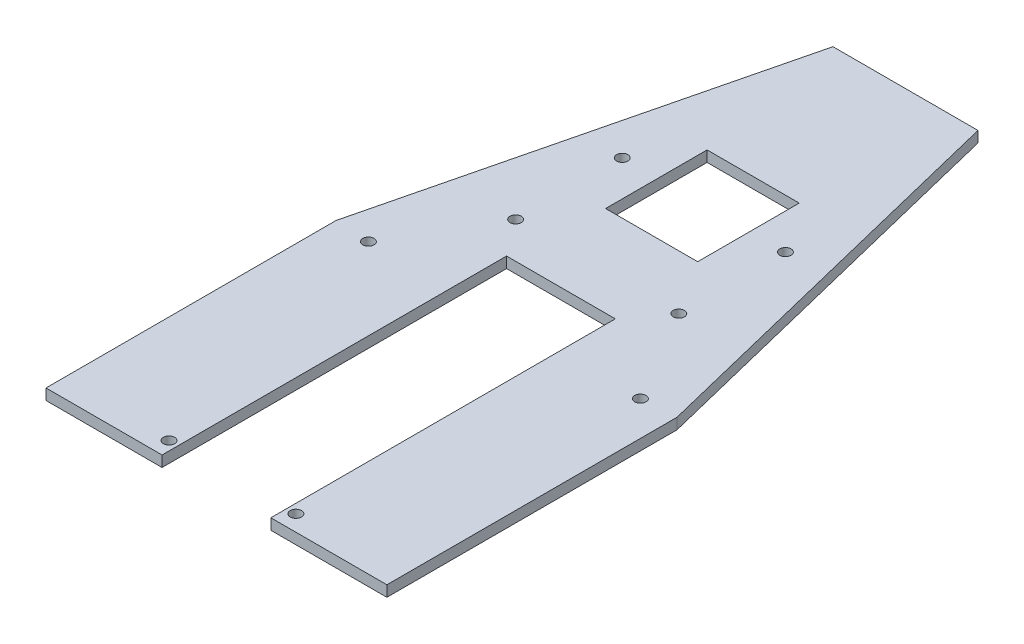
ISO-10303-21;
HEADER;
FILE_DESCRIPTION(('STEP AP214'),'2;1');
FILE_NAME('part.step','',(''),(''),'','','');
FILE_SCHEMA(('AUTOMOTIVE_DESIGN { 1 0 10303 214 1 1 1 1 }'));
ENDSEC;
DATA;
#1=APPLICATION_CONTEXT('core data for automotive mechanical design processes');
#2=APPLICATION_PROTOCOL_DEFINITION('international standard','automotive_design',2000,#1);
#3=PRODUCT_CONTEXT('',#1,'mechanical');
#4=PRODUCT('Part','Part','',(#3));
#5=PRODUCT_RELATED_PRODUCT_CATEGORY('part','',(#4));
#6=PRODUCT_DEFINITION_FORMATION('','',#4);
#7=PRODUCT_DEFINITION_CONTEXT('part definition',#1,'design');
#8=PRODUCT_DEFINITION('design','',#6,#7);
#9=PRODUCT_DEFINITION_SHAPE('','',#8);
#10=(LENGTH_UNIT() NAMED_UNIT(*) SI_UNIT(.MILLI.,.METRE.));
#11=(NAMED_UNIT(*) PLANE_ANGLE_UNIT() SI_UNIT($,.RADIAN.));
#12=(NAMED_UNIT(*) SI_UNIT($,.STERADIAN.) SOLID_ANGLE_UNIT());
#13=UNCERTAINTY_MEASURE_WITH_UNIT(LENGTH_MEASURE(1.E-05),#10,'distance_accuracy_value','');
#14=(GEOMETRIC_REPRESENTATION_CONTEXT(3) GLOBAL_UNCERTAINTY_ASSIGNED_CONTEXT((#13)) GLOBAL_UNIT_ASSIGNED_CONTEXT((#10,
#11,#12)) REPRESENTATION_CONTEXT('',''));
#15=CARTESIAN_POINT('',(0.,0.,0.));
#16=DIRECTION('',(0.,0.,1.));
#17=DIRECTION('',(1.,0.,0.));
#18=AXIS2_PLACEMENT_3D('',#15,#16,#17);
#19=CARTESIAN_POINT('',(-15.,3.,0.));
#20=DIRECTION('',(-1.,0.,0.));
#21=DIRECTION('',(0.,0.,1.));
#22=AXIS2_PLACEMENT_3D('',#19,#20,#21);
#23=PLANE('',#22);
#24=DIRECTION('',(0.,0.,-1.));
#25=VECTOR('',#24,1.);
#26=CARTESIAN_POINT('',(-15.,0.,0.));
#27=LINE('',#26,#25);
#28=CARTESIAN_POINT('',(-15.,0.,95.));
#29=VERTEX_POINT('',#28);
#30=CARTESIAN_POINT('',(-15.,0.,0.));
#31=VERTEX_POINT('',#30);
#32=EDGE_CURVE('E180',#29,#31,#27,.T.);
#33=ORIENTED_EDGE('',*,*,#32,.T.);
#34=DIRECTION('',(0.,-1.,0.));
#35=VECTOR('',#34,1.);
#36=CARTESIAN_POINT('',(-15.,3.,0.));
#37=LINE('',#36,#35);
#38=CARTESIAN_POINT('',(-15.,3.,0.));
#39=VERTEX_POINT('',#38);
#40=EDGE_CURVE('E282',#39,#31,#37,.T.);
#41=ORIENTED_EDGE('',*,*,#40,.F.);
#42=DIRECTION('',(0.,0.,-1.));
#43=VECTOR('',#42,1.);
#44=CARTESIAN_POINT('',(-15.,3.,0.));
#45=LINE('',#44,#43);
#46=CARTESIAN_POINT('',(-15.,3.,95.));
#47=VERTEX_POINT('',#46);
#48=EDGE_CURVE('E185',#47,#39,#45,.T.);
#49=ORIENTED_EDGE('',*,*,#48,.F.);
#50=DIRECTION('',(0.,-1.,0.));
#51=VECTOR('',#50,1.);
#52=CARTESIAN_POINT('',(-15.,3.,95.));
#53=LINE('',#52,#51);
#54=EDGE_CURVE('E217',#47,#29,#53,.T.);
#55=ORIENTED_EDGE('',*,*,#54,.T.);
#56=EDGE_LOOP('',(#33,#41,#49,#55));
#57=FACE_BOUND('',#56,.T.);
#58=ADVANCED_FACE('F47',(#57),#23,.F.);
#59=CARTESIAN_POINT('',(15.,3.,0.));
#60=DIRECTION('',(0.,0.,-1.));
#61=DIRECTION('',(-1.,0.,0.));
#62=AXIS2_PLACEMENT_3D('',#59,#60,#61);
#63=PLANE('',#62);
#64=DIRECTION('',(1.,0.,0.));
#65=VECTOR('',#64,1.);
#66=CARTESIAN_POINT('',(15.,0.,0.));
#67=LINE('',#66,#65);
#68=CARTESIAN_POINT('',(15.,0.,0.));
#69=VERTEX_POINT('',#68);
#70=EDGE_CURVE('E221',#31,#69,#67,.T.);
#71=ORIENTED_EDGE('',*,*,#70,.T.);
#72=DIRECTION('',(0.,-1.,0.));
#73=VECTOR('',#72,1.);
#74=CARTESIAN_POINT('',(15.,3.,0.));
#75=LINE('',#74,#73);
#76=CARTESIAN_POINT('',(15.,3.,0.));
#77=VERTEX_POINT('',#76);
#78=EDGE_CURVE('E278',#77,#69,#75,.T.);
#79=ORIENTED_EDGE('',*,*,#78,.F.);
#80=DIRECTION('',(1.,0.,0.));
#81=VECTOR('',#80,1.);
#82=CARTESIAN_POINT('',(15.,3.,0.));
#83=LINE('',#82,#81);
#84=EDGE_CURVE('E189',#39,#77,#83,.T.);
#85=ORIENTED_EDGE('',*,*,#84,.F.);
#86=ORIENTED_EDGE('',*,*,#40,.T.);
#87=EDGE_LOOP('',(#71,#79,#85,#86));
#88=FACE_BOUND('',#87,.T.);
#89=ADVANCED_FACE('F381',(#88),#63,.F.);
#90=CARTESIAN_POINT('',(15.,3.,95.));
#91=DIRECTION('',(1.,0.,0.));
#92=DIRECTION('',(0.,0.,-1.));
#93=AXIS2_PLACEMENT_3D('',#90,#91,#92);
#94=PLANE('',#93);
#95=DIRECTION('',(0.,0.,1.));
#96=VECTOR('',#95,1.);
#97=CARTESIAN_POINT('',(15.,0.,95.));
#98=LINE('',#97,#96);
#99=CARTESIAN_POINT('',(15.,0.,95.));
#100=VERTEX_POINT('',#99);
#101=EDGE_CURVE('E224',#69,#100,#98,.T.);
#102=ORIENTED_EDGE('',*,*,#101,.T.);
#103=DIRECTION('',(0.,-1.,0.));
#104=VECTOR('',#103,1.);
#105=CARTESIAN_POINT('',(15.,3.,95.));
#106=LINE('',#105,#104);
#107=CARTESIAN_POINT('',(15.,3.,95.));
#108=VERTEX_POINT('',#107);
#109=EDGE_CURVE('E274',#108,#100,#106,.T.);
#110=ORIENTED_EDGE('',*,*,#109,.F.);
#111=DIRECTION('',(0.,0.,1.));
#112=VECTOR('',#111,1.);
#113=CARTESIAN_POINT('',(15.,3.,95.));
#114=LINE('',#113,#112);
#115=EDGE_CURVE('E193',#77,#108,#114,.T.);
#116=ORIENTED_EDGE('',*,*,#115,.F.);
#117=ORIENTED_EDGE('',*,*,#78,.T.);
#118=EDGE_LOOP('',(#102,#110,#116,#117));
#119=FACE_BOUND('',#118,.T.);
#120=ADVANCED_FACE('F386',(#119),#94,.F.);
#121=CARTESIAN_POINT('',(47.,3.,95.));
#122=DIRECTION('',(0.,0.,-1.));
#123=DIRECTION('',(-1.,0.,0.));
#124=AXIS2_PLACEMENT_3D('',#121,#122,#123);
#125=PLANE('',#124);
#126=DIRECTION('',(1.,0.,0.));
#127=VECTOR('',#126,1.);
#128=CARTESIAN_POINT('',(47.,0.,95.));
#129=LINE('',#128,#127);
#130=CARTESIAN_POINT('',(47.,0.,95.));
#131=VERTEX_POINT('',#130);
#132=EDGE_CURVE('E227',#100,#131,#129,.T.);
#133=ORIENTED_EDGE('',*,*,#132,.T.);
#134=DIRECTION('',(0.,-1.,0.));
#135=VECTOR('',#134,1.);
#136=CARTESIAN_POINT('',(47.,3.,95.));
#137=LINE('',#136,#135);
#138=CARTESIAN_POINT('',(47.,3.,95.));
#139=VERTEX_POINT('',#138);
#140=EDGE_CURVE('E270',#139,#131,#137,.T.);
#141=ORIENTED_EDGE('',*,*,#140,.F.);
#142=DIRECTION('',(1.,0.,0.));
#143=VECTOR('',#142,1.);
#144=CARTESIAN_POINT('',(47.,3.,95.));
#145=LINE('',#144,#143);
#146=EDGE_CURVE('E196',#108,#139,#145,.T.);
#147=ORIENTED_EDGE('',*,*,#146,.F.);
#148=ORIENTED_EDGE('',*,*,#109,.T.);
#149=EDGE_LOOP('',(#133,#141,#147,#148));
#150=FACE_BOUND('',#149,.T.);
#151=ADVANCED_FACE('F426',(#150),#125,.F.);
#152=CARTESIAN_POINT('',(47.,3.,15.));
#153=DIRECTION('',(-1.,0.,0.));
#154=DIRECTION('',(0.,0.,1.));
#155=AXIS2_PLACEMENT_3D('',#152,#153,#154);
#156=PLANE('',#155);
#157=DIRECTION('',(0.,0.,-1.));
#158=VECTOR('',#157,1.);
#159=CARTESIAN_POINT('',(47.,0.,15.));
#160=LINE('',#159,#158);
#161=CARTESIAN_POINT('',(47.,0.,15.));
#162=VERTEX_POINT('',#161);
#163=EDGE_CURVE('E230',#131,#162,#160,.T.);
#164=ORIENTED_EDGE('',*,*,#163,.T.);
#165=DIRECTION('',(0.,-1.,0.));
#166=VECTOR('',#165,1.);
#167=CARTESIAN_POINT('',(47.,3.,15.));
#168=LINE('',#167,#166);
#169=CARTESIAN_POINT('',(47.,3.,15.));
#170=VERTEX_POINT('',#169);
#171=EDGE_CURVE('E266',#170,#162,#168,.T.);
#172=ORIENTED_EDGE('',*,*,#171,.F.);
#173=DIRECTION('',(0.,0.,-1.));
#174=VECTOR('',#173,1.);
#175=CARTESIAN_POINT('',(47.,3.,15.));
#176=LINE('',#175,#174);
#177=EDGE_CURVE('E199',#139,#170,#176,.T.);
#178=ORIENTED_EDGE('',*,*,#177,.F.);
#179=ORIENTED_EDGE('',*,*,#140,.T.);
#180=EDGE_LOOP('',(#164,#172,#178,#179));
#181=FACE_BOUND('',#180,.T.);
#182=ADVANCED_FACE('F421',(#181),#156,.F.);
#183=CARTESIAN_POINT('',(20.,3.,-95.));
#184=DIRECTION('',(-0.971172290451625,0.,0.238378653110854));
#185=DIRECTION('',(0.238378653110854,0.,0.971172290451625));
#186=AXIS2_PLACEMENT_3D('',#183,#184,#185);
#187=PLANE('',#186);
#188=DIRECTION('',(-0.238378653110854,0.,-0.971172290451625));
#189=VECTOR('',#188,1.);
#190=CARTESIAN_POINT('',(20.,0.,-95.));
#191=LINE('',#190,#189);
#192=CARTESIAN_POINT('',(20.,0.,-95.));
#193=VERTEX_POINT('',#192);
#194=EDGE_CURVE('E233',#162,#193,#191,.T.);
#195=ORIENTED_EDGE('',*,*,#194,.T.);
#196=DIRECTION('',(0.,-1.,0.));
#197=VECTOR('',#196,1.);
#198=CARTESIAN_POINT('',(20.,3.,-95.));
#199=LINE('',#198,#197);
#200=CARTESIAN_POINT('',(20.,3.,-95.));
#201=VERTEX_POINT('',#200);
#202=EDGE_CURVE('E262',#201,#193,#199,.T.);
#203=ORIENTED_EDGE('',*,*,#202,.F.);
#204=DIRECTION('',(-0.238378653110854,0.,-0.971172290451625));
#205=VECTOR('',#204,1.);
#206=CARTESIAN_POINT('',(20.,3.,-95.));
#207=LINE('',#206,#205);
#208=EDGE_CURVE('E202',#170,#201,#207,.T.);
#209=ORIENTED_EDGE('',*,*,#208,.F.);
#210=ORIENTED_EDGE('',*,*,#171,.T.);
#211=EDGE_LOOP('',(#195,#203,#209,#210));
#212=FACE_BOUND('',#211,.T.);
#213=ADVANCED_FACE('F417',(#212),#187,.F.);
#214=CARTESIAN_POINT('',(-20.,3.,-95.));
#215=DIRECTION('',(0.,0.,1.));
#216=DIRECTION('',(1.,0.,0.));
#217=AXIS2_PLACEMENT_3D('',#214,#215,#216);
#218=PLANE('',#217);
#219=DIRECTION('',(-1.,0.,0.));
#220=VECTOR('',#219,1.);
#221=CARTESIAN_POINT('',(-20.,0.,-95.));
#222=LINE('',#221,#220);
#223=CARTESIAN_POINT('',(-20.,0.,-95.));
#224=VERTEX_POINT('',#223);
#225=EDGE_CURVE('E236',#193,#224,#222,.T.);
#226=ORIENTED_EDGE('',*,*,#225,.T.);
#227=DIRECTION('',(0.,-1.,0.));
#228=VECTOR('',#227,1.);
#229=CARTESIAN_POINT('',(-20.,3.,-95.));
#230=LINE('',#229,#228);
#231=CARTESIAN_POINT('',(-20.,3.,-95.));
#232=VERTEX_POINT('',#231);
#233=EDGE_CURVE('E258',#232,#224,#230,.T.);
#234=ORIENTED_EDGE('',*,*,#233,.F.);
#235=DIRECTION('',(-1.,0.,0.));
#236=VECTOR('',#235,1.);
#237=CARTESIAN_POINT('',(-20.,3.,-95.));
#238=LINE('',#237,#236);
#239=EDGE_CURVE('E205',#201,#232,#238,.T.);
#240=ORIENTED_EDGE('',*,*,#239,.F.);
#241=ORIENTED_EDGE('',*,*,#202,.T.);
#242=EDGE_LOOP('',(#226,#234,#240,#241));
#243=FACE_BOUND('',#242,.T.);
#244=ADVANCED_FACE('F413',(#243),#218,.F.);
#245=CARTESIAN_POINT('',(-47.,3.,15.));
#246=DIRECTION('',(0.971172290451625,0.,0.238378653110853));
#247=DIRECTION('',(0.238378653110853,0.,-0.971172290451625));
#248=AXIS2_PLACEMENT_3D('',#245,#246,#247);
#249=PLANE('',#248);
#250=DIRECTION('',(-0.238378653110853,0.,0.971172290451625));
#251=VECTOR('',#250,1.);
#252=CARTESIAN_POINT('',(-47.,0.,15.));
#253=LINE('',#252,#251);
#254=CARTESIAN_POINT('',(-47.,0.,15.));
#255=VERTEX_POINT('',#254);
#256=EDGE_CURVE('E239',#224,#255,#253,.T.);
#257=ORIENTED_EDGE('',*,*,#256,.T.);
#258=DIRECTION('',(0.,-1.,0.));
#259=VECTOR('',#258,1.);
#260=CARTESIAN_POINT('',(-47.,3.,15.));
#261=LINE('',#260,#259);
#262=CARTESIAN_POINT('',(-47.,3.,15.));
#263=VERTEX_POINT('',#262);
#264=EDGE_CURVE('E254',#263,#255,#261,.T.);
#265=ORIENTED_EDGE('',*,*,#264,.F.);
#266=DIRECTION('',(-0.238378653110853,0.,0.971172290451625));
#267=VECTOR('',#266,1.);
#268=CARTESIAN_POINT('',(-47.,3.,15.));
#269=LINE('',#268,#267);
#270=EDGE_CURVE('E208',#232,#263,#269,.T.);
#271=ORIENTED_EDGE('',*,*,#270,.F.);
#272=ORIENTED_EDGE('',*,*,#233,.T.);
#273=EDGE_LOOP('',(#257,#265,#271,#272));
#274=FACE_BOUND('',#273,.T.);
#275=ADVANCED_FACE('F408',(#274),#249,.F.);
#276=CARTESIAN_POINT('',(-47.,3.,95.));
#277=DIRECTION('',(1.,0.,0.));
#278=DIRECTION('',(0.,0.,-1.));
#279=AXIS2_PLACEMENT_3D('',#276,#277,#278);
#280=PLANE('',#279);
#281=DIRECTION('',(0.,0.,1.));
#282=VECTOR('',#281,1.);
#283=CARTESIAN_POINT('',(-47.,0.,95.));
#284=LINE('',#283,#282);
#285=CARTESIAN_POINT('',(-47.,0.,95.));
#286=VERTEX_POINT('',#285);
#287=EDGE_CURVE('E242',#255,#286,#284,.T.);
#288=ORIENTED_EDGE('',*,*,#287,.T.);
#289=DIRECTION('',(0.,-1.,0.));
#290=VECTOR('',#289,1.);
#291=CARTESIAN_POINT('',(-47.,3.,95.));
#292=LINE('',#291,#290);
#293=CARTESIAN_POINT('',(-47.,3.,95.));
#294=VERTEX_POINT('',#293);
#295=EDGE_CURVE('E250',#294,#286,#292,.T.);
#296=ORIENTED_EDGE('',*,*,#295,.F.);
#297=DIRECTION('',(0.,0.,1.));
#298=VECTOR('',#297,1.);
#299=CARTESIAN_POINT('',(-47.,3.,95.));
#300=LINE('',#299,#298);
#301=EDGE_CURVE('E211',#263,#294,#300,.T.);
#302=ORIENTED_EDGE('',*,*,#301,.F.);
#303=ORIENTED_EDGE('',*,*,#264,.T.);
#304=EDGE_LOOP('',(#288,#296,#302,#303));
#305=FACE_BOUND('',#304,.T.);
#306=ADVANCED_FACE('F375',(#305),#280,.F.);
#307=CARTESIAN_POINT('',(-15.,3.,95.));
#308=DIRECTION('',(0.,0.,-1.));
#309=DIRECTION('',(-1.,0.,0.));
#310=AXIS2_PLACEMENT_3D('',#307,#308,#309);
#311=PLANE('',#310);
#312=DIRECTION('',(1.,0.,0.));
#313=VECTOR('',#312,1.);
#314=CARTESIAN_POINT('',(-15.,0.,95.));
#315=LINE('',#314,#313);
#316=EDGE_CURVE('E190',#286,#29,#315,.T.);
#317=ORIENTED_EDGE('',*,*,#316,.T.);
#318=ORIENTED_EDGE('',*,*,#54,.F.);
#319=DIRECTION('',(1.,0.,0.));
#320=VECTOR('',#319,1.);
#321=CARTESIAN_POINT('',(-15.,3.,95.));
#322=LINE('',#321,#320);
#323=EDGE_CURVE('E214',#294,#47,#322,.T.);
#324=ORIENTED_EDGE('',*,*,#323,.F.);
#325=ORIENTED_EDGE('',*,*,#295,.T.);
#326=EDGE_LOOP('',(#317,#318,#324,#325));
#327=FACE_BOUND('',#326,.T.);
#328=ADVANCED_FACE('F364',(#327),#311,.F.);
#329=CARTESIAN_POINT('',(0.,3.,0.));
#330=DIRECTION('',(0.,-1.,0.));
#331=DIRECTION('',(0.,0.,-1.));
#332=AXIS2_PLACEMENT_3D('',#329,#330,#331);
#333=PLANE('',#332);
#334=CARTESIAN_POINT('',(-22.5,3.,-10.));
#335=DIRECTION('',(0.,1.,0.));
#336=DIRECTION('',(0.,0.,1.));
#337=AXIS2_PLACEMENT_3D('',#334,#335,#336);
#338=CIRCLE('',#337,1.55);
#339=CARTESIAN_POINT('',(-22.5,3.,-8.45));
#340=VERTEX_POINT('',#339);
#341=EDGE_CURVE('E320',#340,#340,#338,.T.);
#342=ORIENTED_EDGE('',*,*,#341,.F.);
#343=EDGE_LOOP('',(#342));
#344=FACE_BOUND('',#343,.T.);
#345=CARTESIAN_POINT('',(22.5,3.,-10.));
#346=DIRECTION('',(0.,1.,0.));
#347=DIRECTION('',(0.,0.,1.));
#348=AXIS2_PLACEMENT_3D('',#345,#346,#347);
#349=CIRCLE('',#348,1.55);
#350=CARTESIAN_POINT('',(22.5,3.,-8.45));
#351=VERTEX_POINT('',#350);
#352=EDGE_CURVE('E328',#351,#351,#349,.T.);
#353=ORIENTED_EDGE('',*,*,#352,.F.);
#354=EDGE_LOOP('',(#353));
#355=FACE_BOUND('',#354,.T.);
#356=CARTESIAN_POINT('',(22.5,3.,-39.4));
#357=DIRECTION('',(0.,1.,0.));
#358=DIRECTION('',(0.,0.,1.));
#359=AXIS2_PLACEMENT_3D('',#356,#357,#358);
#360=CIRCLE('',#359,1.54999999999999);
#361=CARTESIAN_POINT('',(22.5,3.,-37.85));
#362=VERTEX_POINT('',#361);
#363=EDGE_CURVE('E340',#362,#362,#360,.T.);
#364=ORIENTED_EDGE('',*,*,#363,.F.);
#365=EDGE_LOOP('',(#364));
#366=FACE_BOUND('',#365,.T.);
#367=CARTESIAN_POINT('',(37.5,3.,15.6));
#368=DIRECTION('',(0.,1.,0.));
#369=DIRECTION('',(0.,0.,1.));
#370=AXIS2_PLACEMENT_3D('',#367,#368,#369);
#371=CIRCLE('',#370,1.55);
#372=CARTESIAN_POINT('',(37.5,3.,17.15));
#373=VERTEX_POINT('',#372);
#374=EDGE_CURVE('E344',#373,#373,#371,.T.);
#375=ORIENTED_EDGE('',*,*,#374,.F.);
#376=EDGE_LOOP('',(#375));
#377=FACE_BOUND('',#376,.T.);
#378=CARTESIAN_POINT('',(-37.5,3.,15.6));
#379=DIRECTION('',(0.,1.,0.));
#380=DIRECTION('',(0.,0.,1.));
#381=AXIS2_PLACEMENT_3D('',#378,#379,#380);
#382=CIRCLE('',#381,1.55);
#383=CARTESIAN_POINT('',(-37.5,3.,17.15));
#384=VERTEX_POINT('',#383);
#385=EDGE_CURVE('E348',#384,#384,#382,.T.);
#386=ORIENTED_EDGE('',*,*,#385,.F.);
#387=EDGE_LOOP('',(#386));
#388=FACE_BOUND('',#387,.T.);
#389=CARTESIAN_POINT('',(-17.5,3.,90.6));
#390=DIRECTION('',(0.,1.,0.));
#391=DIRECTION('',(0.,0.,1.));
#392=AXIS2_PLACEMENT_3D('',#389,#390,#391);
#393=CIRCLE('',#392,1.55);
#394=CARTESIAN_POINT('',(-17.5,3.,92.15));
#395=VERTEX_POINT('',#394);
#396=EDGE_CURVE('E339',#395,#395,#393,.T.);
#397=ORIENTED_EDGE('',*,*,#396,.F.);
#398=EDGE_LOOP('',(#397));
#399=FACE_BOUND('',#398,.T.);
#400=CARTESIAN_POINT('',(17.5,3.,90.6));
#401=DIRECTION('',(0.,1.,0.));
#402=DIRECTION('',(0.,0.,1.));
#403=AXIS2_PLACEMENT_3D('',#400,#401,#402);
#404=CIRCLE('',#403,1.55);
#405=CARTESIAN_POINT('',(17.5,3.,92.15));
#406=VERTEX_POINT('',#405);
#407=EDGE_CURVE('E326',#406,#406,#404,.T.);
#408=ORIENTED_EDGE('',*,*,#407,.F.);
#409=EDGE_LOOP('',(#408));
#410=FACE_BOUND('',#409,.T.);
#411=CARTESIAN_POINT('',(-22.5,3.,-39.4));
#412=DIRECTION('',(0.,1.,0.));
#413=DIRECTION('',(0.,0.,1.));
#414=AXIS2_PLACEMENT_3D('',#411,#412,#413);
#415=CIRCLE('',#414,1.55);
#416=CARTESIAN_POINT('',(-22.5,3.,-37.85));
#417=VERTEX_POINT('',#416);
#418=EDGE_CURVE('E298',#417,#417,#415,.T.);
#419=ORIENTED_EDGE('',*,*,#418,.F.);
#420=EDGE_LOOP('',(#419));
#421=FACE_BOUND('',#420,.T.);
#422=DIRECTION('',(1.,0.,0.));
#423=VECTOR('',#422,1.);
#424=CARTESIAN_POINT('',(-12.7,3.,-25.));
#425=LINE('',#424,#423);
#426=CARTESIAN_POINT('',(-12.7,3.,-25.));
#427=VERTEX_POINT('',#426);
#428=CARTESIAN_POINT('',(12.7,3.,-25.));
#429=VERTEX_POINT('',#428);
#430=EDGE_CURVE('E162',#427,#429,#425,.T.);
#431=ORIENTED_EDGE('',*,*,#430,.F.);
#432=DIRECTION('',(0.,0.,1.));
#433=VECTOR('',#432,1.);
#434=CARTESIAN_POINT('',(-12.7,3.,-25.));
#435=LINE('',#434,#433);
#436=CARTESIAN_POINT('',(-12.7,3.,-53.));
#437=VERTEX_POINT('',#436);
#438=EDGE_CURVE('E64',#437,#427,#435,.T.);
#439=ORIENTED_EDGE('',*,*,#438,.F.);
#440=DIRECTION('',(-1.,0.,0.));
#441=VECTOR('',#440,1.);
#442=CARTESIAN_POINT('',(-12.7,3.,-53.));
#443=LINE('',#442,#441);
#444=CARTESIAN_POINT('',(12.7,3.,-53.));
#445=VERTEX_POINT('',#444);
#446=EDGE_CURVE('E170',#445,#437,#443,.T.);
#447=ORIENTED_EDGE('',*,*,#446,.F.);
#448=DIRECTION('',(0.,0.,-1.));
#449=VECTOR('',#448,1.);
#450=CARTESIAN_POINT('',(12.7,3.,-25.));
#451=LINE('',#450,#449);
#452=EDGE_CURVE('E152',#429,#445,#451,.T.);
#453=ORIENTED_EDGE('',*,*,#452,.F.);
#454=EDGE_LOOP('',(#431,#439,#447,#453));
#455=FACE_BOUND('',#454,.T.);
#456=ORIENTED_EDGE('',*,*,#48,.T.);
#457=ORIENTED_EDGE('',*,*,#84,.T.);
#458=ORIENTED_EDGE('',*,*,#115,.T.);
#459=ORIENTED_EDGE('',*,*,#146,.T.);
#460=ORIENTED_EDGE('',*,*,#177,.T.);
#461=ORIENTED_EDGE('',*,*,#208,.T.);
#462=ORIENTED_EDGE('',*,*,#239,.T.);
#463=ORIENTED_EDGE('',*,*,#270,.T.);
#464=ORIENTED_EDGE('',*,*,#301,.T.);
#465=ORIENTED_EDGE('',*,*,#323,.T.);
#466=EDGE_LOOP('',(#456,#457,#458,#459,#460,#461,#462,#463,#464,#465));
#467=FACE_BOUND('',#466,.T.);
#468=ADVANCED_FACE('F167',(#344,#355,#366,#377,#388,#399,#410,#421,#455,#467),#333,.F.);
#469=CARTESIAN_POINT('',(0.,0.,0.));
#470=DIRECTION('',(0.,-1.,0.));
#471=DIRECTION('',(0.,0.,-1.));
#472=AXIS2_PLACEMENT_3D('',#469,#470,#471);
#473=PLANE('',#472);
#474=CARTESIAN_POINT('',(-22.5,0.,-10.));
#475=DIRECTION('',(0.,-1.,0.));
#476=DIRECTION('',(0.,0.,-1.));
#477=AXIS2_PLACEMENT_3D('',#474,#475,#476);
#478=CIRCLE('',#477,1.55);
#479=CARTESIAN_POINT('',(-22.5,0.,-11.55));
#480=VERTEX_POINT('',#479);
#481=EDGE_CURVE('E50',#480,#480,#478,.T.);
#482=ORIENTED_EDGE('',*,*,#481,.F.);
#483=EDGE_LOOP('',(#482));
#484=FACE_BOUND('',#483,.T.);
#485=CARTESIAN_POINT('',(22.5,0.,-10.));
#486=DIRECTION('',(0.,-1.,0.));
#487=DIRECTION('',(0.,0.,-1.));
#488=AXIS2_PLACEMENT_3D('',#485,#486,#487);
#489=CIRCLE('',#488,1.55);
#490=CARTESIAN_POINT('',(22.5,0.,-11.55));
#491=VERTEX_POINT('',#490);
#492=EDGE_CURVE('E317',#491,#491,#489,.T.);
#493=ORIENTED_EDGE('',*,*,#492,.F.);
#494=EDGE_LOOP('',(#493));
#495=FACE_BOUND('',#494,.T.);
#496=CARTESIAN_POINT('',(22.5,0.,-39.4));
#497=DIRECTION('',(0.,-1.,0.));
#498=DIRECTION('',(0.,0.,-1.));
#499=AXIS2_PLACEMENT_3D('',#496,#497,#498);
#500=CIRCLE('',#499,1.54999999999999);
#501=CARTESIAN_POINT('',(22.5,0.,-40.95));
#502=VERTEX_POINT('',#501);
#503=EDGE_CURVE('E314',#502,#502,#500,.T.);
#504=ORIENTED_EDGE('',*,*,#503,.F.);
#505=EDGE_LOOP('',(#504));
#506=FACE_BOUND('',#505,.T.);
#507=CARTESIAN_POINT('',(37.5,0.,15.6));
#508=DIRECTION('',(0.,-1.,0.));
#509=DIRECTION('',(0.,0.,-1.));
#510=AXIS2_PLACEMENT_3D('',#507,#508,#509);
#511=CIRCLE('',#510,1.55);
#512=CARTESIAN_POINT('',(37.5,0.,14.05));
#513=VERTEX_POINT('',#512);
#514=EDGE_CURVE('E310',#513,#513,#511,.T.);
#515=ORIENTED_EDGE('',*,*,#514,.F.);
#516=EDGE_LOOP('',(#515));
#517=FACE_BOUND('',#516,.T.);
#518=CARTESIAN_POINT('',(-37.5,0.,15.6));
#519=DIRECTION('',(0.,-1.,0.));
#520=DIRECTION('',(0.,0.,-1.));
#521=AXIS2_PLACEMENT_3D('',#518,#519,#520);
#522=CIRCLE('',#521,1.55);
#523=CARTESIAN_POINT('',(-37.5,0.,14.05));
#524=VERTEX_POINT('',#523);
#525=EDGE_CURVE('E306',#524,#524,#522,.T.);
#526=ORIENTED_EDGE('',*,*,#525,.F.);
#527=EDGE_LOOP('',(#526));
#528=FACE_BOUND('',#527,.T.);
#529=CARTESIAN_POINT('',(-17.5,0.,90.6));
#530=DIRECTION('',(0.,-1.,0.));
#531=DIRECTION('',(0.,0.,-1.));
#532=AXIS2_PLACEMENT_3D('',#529,#530,#531);
#533=CIRCLE('',#532,1.55);
#534=CARTESIAN_POINT('',(-17.5,0.,89.05));
#535=VERTEX_POINT('',#534);
#536=EDGE_CURVE('E302',#535,#535,#533,.T.);
#537=ORIENTED_EDGE('',*,*,#536,.F.);
#538=EDGE_LOOP('',(#537));
#539=FACE_BOUND('',#538,.T.);
#540=CARTESIAN_POINT('',(17.5,0.,90.6));
#541=DIRECTION('',(0.,-1.,0.));
#542=DIRECTION('',(0.,0.,-1.));
#543=AXIS2_PLACEMENT_3D('',#540,#541,#542);
#544=CIRCLE('',#543,1.55);
#545=CARTESIAN_POINT('',(17.5,0.,89.05));
#546=VERTEX_POINT('',#545);
#547=EDGE_CURVE('E297',#546,#546,#544,.T.);
#548=ORIENTED_EDGE('',*,*,#547,.F.);
#549=EDGE_LOOP('',(#548));
#550=FACE_BOUND('',#549,.T.);
#551=CARTESIAN_POINT('',(-22.5,0.,-39.4));
#552=DIRECTION('',(0.,-1.,0.));
#553=DIRECTION('',(0.,0.,-1.));
#554=AXIS2_PLACEMENT_3D('',#551,#552,#553);
#555=CIRCLE('',#554,1.55);
#556=CARTESIAN_POINT('',(-22.5,0.,-40.95));
#557=VERTEX_POINT('',#556);
#558=EDGE_CURVE('E293',#557,#557,#555,.T.);
#559=ORIENTED_EDGE('',*,*,#558,.F.);
#560=EDGE_LOOP('',(#559));
#561=FACE_BOUND('',#560,.T.);
#562=DIRECTION('',(0.,0.,-1.));
#563=VECTOR('',#562,1.);
#564=CARTESIAN_POINT('',(-12.7,0.,0.));
#565=LINE('',#564,#563);
#566=CARTESIAN_POINT('',(-12.7,0.,-25.));
#567=VERTEX_POINT('',#566);
#568=CARTESIAN_POINT('',(-12.7,0.,-53.));
#569=VERTEX_POINT('',#568);
#570=EDGE_CURVE('E11',#567,#569,#565,.T.);
#571=ORIENTED_EDGE('',*,*,#570,.F.);
#572=DIRECTION('',(-1.,0.,0.));
#573=VECTOR('',#572,1.);
#574=CARTESIAN_POINT('',(0.,0.,-25.));
#575=LINE('',#574,#573);
#576=CARTESIAN_POINT('',(12.7,0.,-25.));
#577=VERTEX_POINT('',#576);
#578=EDGE_CURVE('E286',#577,#567,#575,.T.);
#579=ORIENTED_EDGE('',*,*,#578,.F.);
#580=DIRECTION('',(0.,0.,1.));
#581=VECTOR('',#580,1.);
#582=CARTESIAN_POINT('',(12.7,0.,0.));
#583=LINE('',#582,#581);
#584=CARTESIAN_POINT('',(12.7,0.,-53.));
#585=VERTEX_POINT('',#584);
#586=EDGE_CURVE('E155',#585,#577,#583,.T.);
#587=ORIENTED_EDGE('',*,*,#586,.F.);
#588=DIRECTION('',(1.,0.,0.));
#589=VECTOR('',#588,1.);
#590=CARTESIAN_POINT('',(0.,0.,-53.));
#591=LINE('',#590,#589);
#592=EDGE_CURVE('E56',#569,#585,#591,.T.);
#593=ORIENTED_EDGE('',*,*,#592,.F.);
#594=EDGE_LOOP('',(#571,#579,#587,#593));
#595=FACE_BOUND('',#594,.T.);
#596=ORIENTED_EDGE('',*,*,#32,.F.);
#597=ORIENTED_EDGE('',*,*,#316,.F.);
#598=ORIENTED_EDGE('',*,*,#287,.F.);
#599=ORIENTED_EDGE('',*,*,#256,.F.);
#600=ORIENTED_EDGE('',*,*,#225,.F.);
#601=ORIENTED_EDGE('',*,*,#194,.F.);
#602=ORIENTED_EDGE('',*,*,#163,.F.);
#603=ORIENTED_EDGE('',*,*,#132,.F.);
#604=ORIENTED_EDGE('',*,*,#101,.F.);
#605=ORIENTED_EDGE('',*,*,#70,.F.);
#606=EDGE_LOOP('',(#596,#597,#598,#599,#600,#601,#602,#603,#604,#605));
#607=FACE_BOUND('',#606,.T.);
#608=ADVANCED_FACE('F363',(#484,#495,#506,#517,#528,#539,#550,#561,#595,#607),#473,.T.);
#609=CARTESIAN_POINT('',(-12.7,-7.,-25.));
#610=DIRECTION('',(-1.,0.,0.));
#611=DIRECTION('',(0.,0.,1.));
#612=AXIS2_PLACEMENT_3D('',#609,#610,#611);
#613=PLANE('',#612);
#614=ORIENTED_EDGE('',*,*,#570,.T.);
#615=DIRECTION('',(0.,1.,0.));
#616=VECTOR('',#615,1.);
#617=CARTESIAN_POINT('',(-12.7,-7.,-53.));
#618=LINE('',#617,#616);
#619=EDGE_CURVE('E177',#569,#437,#618,.T.);
#620=ORIENTED_EDGE('',*,*,#619,.T.);
#621=ORIENTED_EDGE('',*,*,#438,.T.);
#622=DIRECTION('',(0.,1.,0.));
#623=VECTOR('',#622,1.);
#624=CARTESIAN_POINT('',(-12.7,-7.,-25.));
#625=LINE('',#624,#623);
#626=EDGE_CURVE('E159',#567,#427,#625,.T.);
#627=ORIENTED_EDGE('',*,*,#626,.F.);
#628=EDGE_LOOP('',(#614,#620,#621,#627));
#629=FACE_BOUND('',#628,.T.);
#630=ADVANCED_FACE('F371',(#629),#613,.F.);
#631=CARTESIAN_POINT('',(-12.7,-7.,-53.));
#632=DIRECTION('',(0.,0.,-1.));
#633=DIRECTION('',(-1.,0.,0.));
#634=AXIS2_PLACEMENT_3D('',#631,#632,#633);
#635=PLANE('',#634);
#636=ORIENTED_EDGE('',*,*,#592,.T.);
#637=DIRECTION('',(0.,1.,0.));
#638=VECTOR('',#637,1.);
#639=CARTESIAN_POINT('',(12.7,-7.,-53.));
#640=LINE('',#639,#638);
#641=EDGE_CURVE('E158',#585,#445,#640,.T.);
#642=ORIENTED_EDGE('',*,*,#641,.T.);
#643=ORIENTED_EDGE('',*,*,#446,.T.);
#644=ORIENTED_EDGE('',*,*,#619,.F.);
#645=EDGE_LOOP('',(#636,#642,#643,#644));
#646=FACE_BOUND('',#645,.T.);
#647=ADVANCED_FACE('F461',(#646),#635,.F.);
#648=CARTESIAN_POINT('',(12.7,-7.,-25.));
#649=DIRECTION('',(1.,0.,0.));
#650=DIRECTION('',(0.,0.,-1.));
#651=AXIS2_PLACEMENT_3D('',#648,#649,#650);
#652=PLANE('',#651);
#653=ORIENTED_EDGE('',*,*,#586,.T.);
#654=DIRECTION('',(0.,1.,0.));
#655=VECTOR('',#654,1.);
#656=CARTESIAN_POINT('',(12.7,-7.,-25.));
#657=LINE('',#656,#655);
#658=EDGE_CURVE('E72',#577,#429,#657,.T.);
#659=ORIENTED_EDGE('',*,*,#658,.T.);
#660=ORIENTED_EDGE('',*,*,#452,.T.);
#661=ORIENTED_EDGE('',*,*,#641,.F.);
#662=EDGE_LOOP('',(#653,#659,#660,#661));
#663=FACE_BOUND('',#662,.T.);
#664=ADVANCED_FACE('F149',(#663),#652,.F.);
#665=CARTESIAN_POINT('',(-12.7,-7.,-25.));
#666=DIRECTION('',(0.,0.,1.));
#667=DIRECTION('',(1.,0.,0.));
#668=AXIS2_PLACEMENT_3D('',#665,#666,#667);
#669=PLANE('',#668);
#670=ORIENTED_EDGE('',*,*,#578,.T.);
#671=ORIENTED_EDGE('',*,*,#626,.T.);
#672=ORIENTED_EDGE('',*,*,#430,.T.);
#673=ORIENTED_EDGE('',*,*,#658,.F.);
#674=EDGE_LOOP('',(#670,#671,#672,#673));
#675=FACE_BOUND('',#674,.T.);
#676=ADVANCED_FACE('F163',(#675),#669,.F.);
#677=CARTESIAN_POINT('',(-22.5,-7.,-39.4));
#678=DIRECTION('',(0.,1.,0.));
#679=DIRECTION('',(0.,0.,1.));
#680=AXIS2_PLACEMENT_3D('',#677,#678,#679);
#681=CYLINDRICAL_SURFACE('',#680,1.55);
#682=ORIENTED_EDGE('',*,*,#558,.T.);
#683=EDGE_LOOP('',(#682));
#684=FACE_BOUND('',#683,.T.);
#685=ORIENTED_EDGE('',*,*,#418,.T.);
#686=EDGE_LOOP('',(#685));
#687=FACE_BOUND('',#686,.T.);
#688=ADVANCED_FACE('F360',(#684,#687),#681,.F.);
#689=CARTESIAN_POINT('',(17.5,-7.,90.6));
#690=DIRECTION('',(0.,1.,0.));
#691=DIRECTION('',(0.,0.,1.));
#692=AXIS2_PLACEMENT_3D('',#689,#690,#691);
#693=CYLINDRICAL_SURFACE('',#692,1.55);
#694=ORIENTED_EDGE('',*,*,#547,.T.);
#695=EDGE_LOOP('',(#694));
#696=FACE_BOUND('',#695,.T.);
#697=ORIENTED_EDGE('',*,*,#407,.T.);
#698=EDGE_LOOP('',(#697));
#699=FACE_BOUND('',#698,.T.);
#700=ADVANCED_FACE('F491',(#696,#699),#693,.F.);
#701=CARTESIAN_POINT('',(-17.5,-7.,90.6));
#702=DIRECTION('',(0.,1.,0.));
#703=DIRECTION('',(0.,0.,1.));
#704=AXIS2_PLACEMENT_3D('',#701,#702,#703);
#705=CYLINDRICAL_SURFACE('',#704,1.55);
#706=ORIENTED_EDGE('',*,*,#536,.T.);
#707=EDGE_LOOP('',(#706));
#708=FACE_BOUND('',#707,.T.);
#709=ORIENTED_EDGE('',*,*,#396,.T.);
#710=EDGE_LOOP('',(#709));
#711=FACE_BOUND('',#710,.T.);
#712=ADVANCED_FACE('F500',(#708,#711),#705,.F.);
#713=CARTESIAN_POINT('',(-37.5,-7.,15.6));
#714=DIRECTION('',(0.,1.,0.));
#715=DIRECTION('',(0.,0.,1.));
#716=AXIS2_PLACEMENT_3D('',#713,#714,#715);
#717=CYLINDRICAL_SURFACE('',#716,1.55);
#718=ORIENTED_EDGE('',*,*,#525,.T.);
#719=EDGE_LOOP('',(#718));
#720=FACE_BOUND('',#719,.T.);
#721=ORIENTED_EDGE('',*,*,#385,.T.);
#722=EDGE_LOOP('',(#721));
#723=FACE_BOUND('',#722,.T.);
#724=ADVANCED_FACE('F509',(#720,#723),#717,.F.);
#725=CARTESIAN_POINT('',(37.5,-7.,15.6));
#726=DIRECTION('',(0.,1.,0.));
#727=DIRECTION('',(0.,0.,1.));
#728=AXIS2_PLACEMENT_3D('',#725,#726,#727);
#729=CYLINDRICAL_SURFACE('',#728,1.55);
#730=ORIENTED_EDGE('',*,*,#514,.T.);
#731=EDGE_LOOP('',(#730));
#732=FACE_BOUND('',#731,.T.);
#733=ORIENTED_EDGE('',*,*,#374,.T.);
#734=EDGE_LOOP('',(#733));
#735=FACE_BOUND('',#734,.T.);
#736=ADVANCED_FACE('F518',(#732,#735),#729,.F.);
#737=CARTESIAN_POINT('',(22.5,-7.,-39.4));
#738=DIRECTION('',(0.,1.,0.));
#739=DIRECTION('',(0.,0.,1.));
#740=AXIS2_PLACEMENT_3D('',#737,#738,#739);
#741=CYLINDRICAL_SURFACE('',#740,1.54999999999999);
#742=ORIENTED_EDGE('',*,*,#503,.T.);
#743=EDGE_LOOP('',(#742));
#744=FACE_BOUND('',#743,.T.);
#745=ORIENTED_EDGE('',*,*,#363,.T.);
#746=EDGE_LOOP('',(#745));
#747=FACE_BOUND('',#746,.T.);
#748=ADVANCED_FACE('F526',(#744,#747),#741,.F.);
#749=CARTESIAN_POINT('',(22.5,-7.,-10.));
#750=DIRECTION('',(0.,1.,0.));
#751=DIRECTION('',(0.,0.,1.));
#752=AXIS2_PLACEMENT_3D('',#749,#750,#751);
#753=CYLINDRICAL_SURFACE('',#752,1.55);
#754=ORIENTED_EDGE('',*,*,#492,.T.);
#755=EDGE_LOOP('',(#754));
#756=FACE_BOUND('',#755,.T.);
#757=ORIENTED_EDGE('',*,*,#352,.T.);
#758=EDGE_LOOP('',(#757));
#759=FACE_BOUND('',#758,.T.);
#760=ADVANCED_FACE('F534',(#756,#759),#753,.F.);
#761=CARTESIAN_POINT('',(-22.5,-7.,-10.));
#762=DIRECTION('',(0.,1.,0.));
#763=DIRECTION('',(0.,0.,1.));
#764=AXIS2_PLACEMENT_3D('',#761,#762,#763);
#765=CYLINDRICAL_SURFACE('',#764,1.55);
#766=ORIENTED_EDGE('',*,*,#481,.T.);
#767=EDGE_LOOP('',(#766));
#768=FACE_BOUND('',#767,.T.);
#769=ORIENTED_EDGE('',*,*,#341,.T.);
#770=EDGE_LOOP('',(#769));
#771=FACE_BOUND('',#770,.T.);
#772=ADVANCED_FACE('F547',(#768,#771),#765,.F.);
#773=CLOSED_SHELL('',(#58,#89,#120,#151,#182,#213,#244,#275,#306,#328,#468,#608,#630,#647,#664,
#676,#688,#700,#712,#724,#736,#748,#760,#772));
#774=MANIFOLD_SOLID_BREP('B2',#773);
#775=ADVANCED_BREP_SHAPE_REPRESENTATION('',(#18,#774),#14);
#776=SHAPE_DEFINITION_REPRESENTATION(#9,#775);
ENDSEC;
END-ISO-10303-21;
